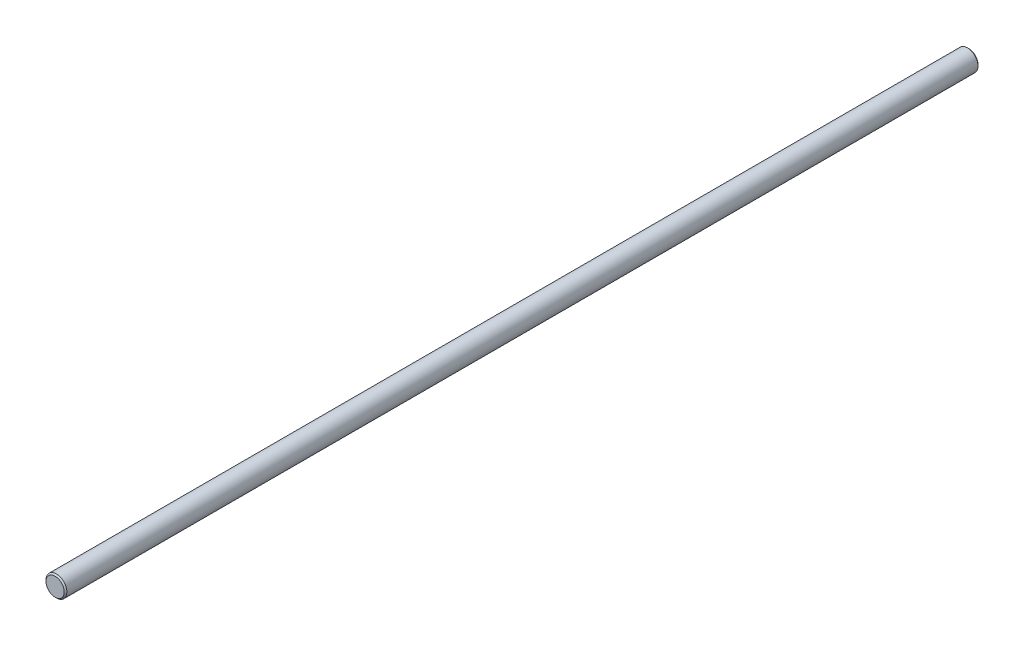
ISO-10303-21;
HEADER;
FILE_DESCRIPTION(('STEP AP214'),'2;1');
FILE_NAME('part.step','',(''),(''),'','','');
FILE_SCHEMA(('AUTOMOTIVE_DESIGN { 1 0 10303 214 1 1 1 1 }'));
ENDSEC;
DATA;
#1=APPLICATION_CONTEXT('core data for automotive mechanical design processes');
#2=APPLICATION_PROTOCOL_DEFINITION('international standard','automotive_design',2000,#1);
#3=PRODUCT_CONTEXT('',#1,'mechanical');
#4=PRODUCT('Part','Part','',(#3));
#5=PRODUCT_RELATED_PRODUCT_CATEGORY('part','',(#4));
#6=PRODUCT_DEFINITION_FORMATION('','',#4);
#7=PRODUCT_DEFINITION_CONTEXT('part definition',#1,'design');
#8=PRODUCT_DEFINITION('design','',#6,#7);
#9=PRODUCT_DEFINITION_SHAPE('','',#8);
#10=(LENGTH_UNIT() NAMED_UNIT(*) SI_UNIT(.MILLI.,.METRE.));
#11=(NAMED_UNIT(*) PLANE_ANGLE_UNIT() SI_UNIT($,.RADIAN.));
#12=(NAMED_UNIT(*) SI_UNIT($,.STERADIAN.) SOLID_ANGLE_UNIT());
#13=UNCERTAINTY_MEASURE_WITH_UNIT(LENGTH_MEASURE(1.E-05),#10,'distance_accuracy_value','');
#14=(GEOMETRIC_REPRESENTATION_CONTEXT(3) GLOBAL_UNCERTAINTY_ASSIGNED_CONTEXT((#13)) GLOBAL_UNIT_ASSIGNED_CONTEXT((#10,
#11,#12)) REPRESENTATION_CONTEXT('',''));
#15=CARTESIAN_POINT('',(0.,0.,0.));
#16=DIRECTION('',(0.,0.,1.));
#17=DIRECTION('',(1.,0.,0.));
#18=AXIS2_PLACEMENT_3D('',#15,#16,#17);
#19=CARTESIAN_POINT('',(0.,0.,350.));
#20=DIRECTION('',(0.,0.,-1.));
#21=DIRECTION('',(-1.,0.,0.));
#22=AXIS2_PLACEMENT_3D('',#19,#20,#21);
#23=CYLINDRICAL_SURFACE('',#22,4.);
#24=CARTESIAN_POINT('',(0.,0.,349.5));
#25=DIRECTION('',(0.,0.,1.));
#26=DIRECTION('',(1.,0.,0.));
#27=AXIS2_PLACEMENT_3D('',#24,#25,#26);
#28=CIRCLE('',#27,4.);
#29=CARTESIAN_POINT('',(4.,0.,349.5));
#30=VERTEX_POINT('',#29);
#31=EDGE_CURVE('E39',#30,#30,#28,.F.);
#32=ORIENTED_EDGE('',*,*,#31,.T.);
#33=EDGE_LOOP('',(#32));
#34=FACE_BOUND('',#33,.T.);
#35=CARTESIAN_POINT('',(0.,0.,0.5));
#36=DIRECTION('',(0.,0.,1.));
#37=DIRECTION('',(1.,0.,0.));
#38=AXIS2_PLACEMENT_3D('',#35,#36,#37);
#39=CIRCLE('',#38,4.);
#40=CARTESIAN_POINT('',(4.,0.,0.5));
#41=VERTEX_POINT('',#40);
#42=EDGE_CURVE('E43',#41,#41,#39,.T.);
#43=ORIENTED_EDGE('',*,*,#42,.T.);
#44=EDGE_LOOP('',(#43));
#45=FACE_BOUND('',#44,.T.);
#46=ADVANCED_FACE('F32',(#34,#45),#23,.T.);
#47=CARTESIAN_POINT('',(0.,0.,350.));
#48=DIRECTION('',(0.,0.,1.));
#49=DIRECTION('',(1.,0.,0.));
#50=AXIS2_PLACEMENT_3D('',#47,#48,#49);
#51=PLANE('',#50);
#52=CARTESIAN_POINT('',(0.,0.,350.));
#53=DIRECTION('',(0.,0.,1.));
#54=DIRECTION('',(1.,0.,0.));
#55=AXIS2_PLACEMENT_3D('',#52,#53,#54);
#56=CIRCLE('',#55,3.50000000000003);
#57=CARTESIAN_POINT('',(3.50000000000003,0.,350.));
#58=VERTEX_POINT('',#57);
#59=EDGE_CURVE('E47',#58,#58,#56,.T.);
#60=ORIENTED_EDGE('',*,*,#59,.T.);
#61=EDGE_LOOP('',(#60));
#62=FACE_BOUND('',#61,.T.);
#63=ADVANCED_FACE('F53',(#62),#51,.T.);
#64=CARTESIAN_POINT('',(0.,0.,0.));
#65=DIRECTION('',(0.,0.,1.));
#66=DIRECTION('',(1.,0.,0.));
#67=AXIS2_PLACEMENT_3D('',#64,#65,#66);
#68=PLANE('',#67);
#69=CARTESIAN_POINT('',(0.,0.,0.));
#70=DIRECTION('',(0.,0.,1.));
#71=DIRECTION('',(1.,0.,0.));
#72=AXIS2_PLACEMENT_3D('',#69,#70,#71);
#73=CIRCLE('',#72,3.5);
#74=CARTESIAN_POINT('',(3.5,0.,0.));
#75=VERTEX_POINT('',#74);
#76=EDGE_CURVE('E10',#75,#75,#73,.F.);
#77=ORIENTED_EDGE('',*,*,#76,.T.);
#78=EDGE_LOOP('',(#77));
#79=FACE_BOUND('',#78,.T.);
#80=ADVANCED_FACE('F57',(#79),#68,.F.);
#81=CARTESIAN_POINT('',(0.,0.,350.));
#82=DIRECTION('',(0.,0.,-1.));
#83=DIRECTION('',(-1.,0.,0.));
#84=AXIS2_PLACEMENT_3D('',#81,#82,#83);
#85=CONICAL_SURFACE('',#84,3.50000000000003,0.785398163397473);
#86=ORIENTED_EDGE('',*,*,#31,.F.);
#87=EDGE_LOOP('',(#86));
#88=FACE_BOUND('',#87,.T.);
#89=ORIENTED_EDGE('',*,*,#59,.F.);
#90=EDGE_LOOP('',(#89));
#91=FACE_BOUND('',#90,.T.);
#92=ADVANCED_FACE('F55',(#88,#91),#85,.T.);
#93=CARTESIAN_POINT('',(0.,0.,0.5));
#94=DIRECTION('',(0.,0.,1.));
#95=DIRECTION('',(1.,0.,0.));
#96=AXIS2_PLACEMENT_3D('',#93,#94,#95);
#97=CONICAL_SURFACE('',#96,4.,0.785398163397445);
#98=ORIENTED_EDGE('',*,*,#76,.F.);
#99=EDGE_LOOP('',(#98));
#100=FACE_BOUND('',#99,.T.);
#101=ORIENTED_EDGE('',*,*,#42,.F.);
#102=EDGE_LOOP('',(#101));
#103=FACE_BOUND('',#102,.T.);
#104=ADVANCED_FACE('F34',(#100,#103),#97,.T.);
#105=CLOSED_SHELL('',(#46,#63,#80,#92,#104));
#106=MANIFOLD_SOLID_BREP('B2',#105);
#107=ADVANCED_BREP_SHAPE_REPRESENTATION('',(#18,#106),#14);
#108=SHAPE_DEFINITION_REPRESENTATION(#9,#107);
ENDSEC;
END-ISO-10303-21;
